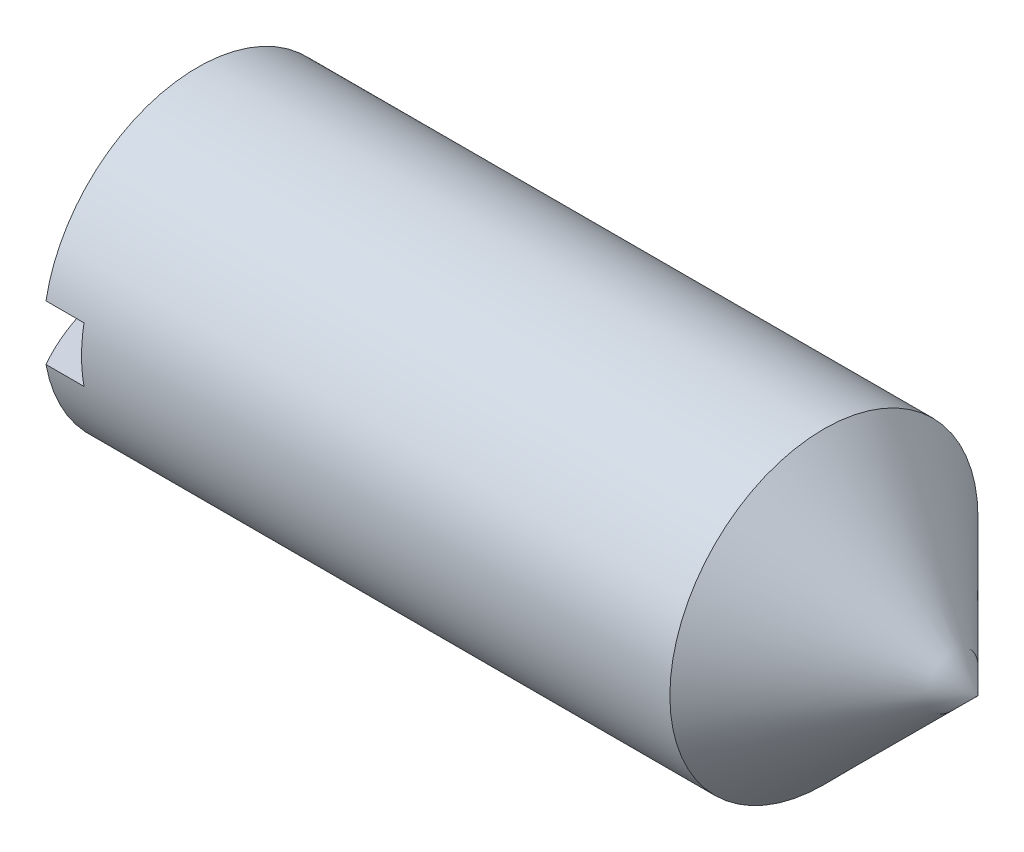
ISO-10303-21;
HEADER;
FILE_DESCRIPTION(('STEP AP214'),'2;1');
FILE_NAME('part.step','',(''),(''),'','','');
FILE_SCHEMA(('AUTOMOTIVE_DESIGN { 1 0 10303 214 1 1 1 1 }'));
ENDSEC;
DATA;
#1=APPLICATION_CONTEXT('core data for automotive mechanical design processes');
#2=APPLICATION_PROTOCOL_DEFINITION('international standard','automotive_design',2000,#1);
#3=PRODUCT_CONTEXT('',#1,'mechanical');
#4=PRODUCT('Part','Part','',(#3));
#5=PRODUCT_RELATED_PRODUCT_CATEGORY('part','',(#4));
#6=PRODUCT_DEFINITION_FORMATION('','',#4);
#7=PRODUCT_DEFINITION_CONTEXT('part definition',#1,'design');
#8=PRODUCT_DEFINITION('design','',#6,#7);
#9=PRODUCT_DEFINITION_SHAPE('','',#8);
#10=(LENGTH_UNIT() NAMED_UNIT(*) SI_UNIT(.MILLI.,.METRE.));
#11=(NAMED_UNIT(*) PLANE_ANGLE_UNIT() SI_UNIT($,.RADIAN.));
#12=(NAMED_UNIT(*) SI_UNIT($,.STERADIAN.) SOLID_ANGLE_UNIT());
#13=UNCERTAINTY_MEASURE_WITH_UNIT(LENGTH_MEASURE(1.E-05),#10,'distance_accuracy_value','');
#14=(GEOMETRIC_REPRESENTATION_CONTEXT(3) GLOBAL_UNCERTAINTY_ASSIGNED_CONTEXT((#13)) GLOBAL_UNIT_ASSIGNED_CONTEXT((#10,
#11,#12)) REPRESENTATION_CONTEXT('',''));
#15=CARTESIAN_POINT('',(0.,0.,0.));
#16=DIRECTION('',(0.,0.,1.));
#17=DIRECTION('',(1.,0.,0.));
#18=AXIS2_PLACEMENT_3D('',#15,#16,#17);
#19=CARTESIAN_POINT('',(19.05,0.,0.));
#20=DIRECTION('',(-1.,0.,0.));
#21=DIRECTION('',(0.,1.,0.));
#22=AXIS2_PLACEMENT_3D('',#19,#20,#21);
#23=SPHERICAL_SURFACE('',#22,19.05);
#24=CARTESIAN_POINT('',(19.05,1.7018,0.));
#25=DIRECTION('',(0.,-1.,0.));
#26=DIRECTION('',(0.,0.,-1.));
#27=AXIS2_PLACEMENT_3D('',#24,#25,#26);
#28=CIRCLE('',#27,18.9738340026469);
#29=CARTESIAN_POINT('',(2.55221605790645,1.7018,9.37173952689681));
#30=VERTEX_POINT('',#29);
#31=CARTESIAN_POINT('',(2.55221605790645,1.7018,-9.37173952689681));
#32=VERTEX_POINT('',#31);
#33=EDGE_CURVE('E97',#30,#32,#28,.T.);
#34=ORIENTED_EDGE('',*,*,#33,.F.);
#35=CARTESIAN_POINT('',(2.55221605790645,0.,0.));
#36=DIRECTION('',(-1.,0.,0.));
#37=DIRECTION('',(0.,0.,1.));
#38=AXIS2_PLACEMENT_3D('',#35,#36,#37);
#39=CIRCLE('',#38,9.525);
#40=EDGE_CURVE('E89',#30,#32,#39,.T.);
#41=ORIENTED_EDGE('',*,*,#40,.T.);
#42=EDGE_LOOP('',(#34,#41));
#43=FACE_BOUND('',#42,.T.);
#44=ADVANCED_FACE('F32',(#43),#23,.T.);
#45=CARTESIAN_POINT('',(19.05,-1.7018,0.));
#46=DIRECTION('',(0.,1.,0.));
#47=DIRECTION('',(0.,0.,1.));
#48=AXIS2_PLACEMENT_3D('',#45,#46,#47);
#49=CIRCLE('',#48,18.9738340026469);
#50=CARTESIAN_POINT('',(2.55221605790645,-1.7018,-9.37173952689681));
#51=VERTEX_POINT('',#50);
#52=CARTESIAN_POINT('',(2.55221605790645,-1.7018,9.37173952689681));
#53=VERTEX_POINT('',#52);
#54=EDGE_CURVE('E109',#51,#53,#49,.T.);
#55=ORIENTED_EDGE('',*,*,#54,.F.);
#56=EDGE_CURVE('E92',#51,#53,#39,.T.);
#57=ORIENTED_EDGE('',*,*,#56,.T.);
#58=EDGE_LOOP('',(#55,#57));
#59=FACE_BOUND('',#58,.T.);
#60=ADVANCED_FACE('F108',(#59),#23,.T.);
#61=CARTESIAN_POINT('',(-12.7,0.,0.));
#62=DIRECTION('',(-1.,0.,0.));
#63=DIRECTION('',(0.,0.,1.));
#64=AXIS2_PLACEMENT_3D('',#61,#62,#63);
#65=CYLINDRICAL_SURFACE('',#64,9.525);
#66=CARTESIAN_POINT('',(41.275,0.,0.));
#67=DIRECTION('',(-1.,0.,0.));
#68=DIRECTION('',(0.,0.,1.));
#69=AXIS2_PLACEMENT_3D('',#66,#67,#68);
#70=CIRCLE('',#69,9.525);
#71=CARTESIAN_POINT('',(41.275,0.,9.525));
#72=VERTEX_POINT('',#71);
#73=EDGE_CURVE('E91',#72,#72,#70,.T.);
#74=ORIENTED_EDGE('',*,*,#73,.T.);
#75=EDGE_LOOP('',(#74));
#76=FACE_BOUND('',#75,.T.);
#77=ORIENTED_EDGE('',*,*,#40,.F.);
#78=DIRECTION('',(-1.,0.,0.));
#79=VECTOR('',#78,1.);
#80=CARTESIAN_POINT('',(-12.7,1.7018,9.37173952689681));
#81=LINE('',#80,#79);
#82=CARTESIAN_POINT('',(4.9022,1.7018,9.37173952689681));
#83=VERTEX_POINT('',#82);
#84=EDGE_CURVE('E11',#30,#83,#81,.F.);
#85=ORIENTED_EDGE('',*,*,#84,.T.);
#86=CARTESIAN_POINT('',(4.9022,0.,0.));
#87=DIRECTION('',(1.,0.,0.));
#88=DIRECTION('',(0.,0.,-1.));
#89=AXIS2_PLACEMENT_3D('',#86,#87,#88);
#90=CIRCLE('',#89,9.525);
#91=CARTESIAN_POINT('',(4.9022,-1.7018,9.37173952689681));
#92=VERTEX_POINT('',#91);
#93=EDGE_CURVE('E70',#92,#83,#90,.F.);
#94=ORIENTED_EDGE('',*,*,#93,.F.);
#95=DIRECTION('',(-1.,0.,0.));
#96=VECTOR('',#95,1.);
#97=CARTESIAN_POINT('',(-12.7,-1.7018,9.37173952689681));
#98=LINE('',#97,#96);
#99=EDGE_CURVE('E39',#92,#53,#98,.T.);
#100=ORIENTED_EDGE('',*,*,#99,.T.);
#101=ORIENTED_EDGE('',*,*,#56,.F.);
#102=DIRECTION('',(-1.,0.,0.));
#103=VECTOR('',#102,1.);
#104=CARTESIAN_POINT('',(-12.7,-1.7018,-9.37173952689681));
#105=LINE('',#104,#103);
#106=CARTESIAN_POINT('',(4.9022,-1.7018,-9.37173952689681));
#107=VERTEX_POINT('',#106);
#108=EDGE_CURVE('E101',#51,#107,#105,.F.);
#109=ORIENTED_EDGE('',*,*,#108,.T.);
#110=CARTESIAN_POINT('',(4.9022,1.7018,-9.37173952689681));
#111=VERTEX_POINT('',#110);
#112=EDGE_CURVE('E79',#111,#107,#90,.F.);
#113=ORIENTED_EDGE('',*,*,#112,.F.);
#114=DIRECTION('',(-1.,0.,0.));
#115=VECTOR('',#114,1.);
#116=CARTESIAN_POINT('',(-12.7,1.7018,-9.37173952689681));
#117=LINE('',#116,#115);
#118=EDGE_CURVE('E77',#111,#32,#117,.T.);
#119=ORIENTED_EDGE('',*,*,#118,.T.);
#120=EDGE_LOOP('',(#77,#85,#94,#100,#101,#109,#113,#119));
#121=FACE_BOUND('',#120,.T.);
#122=ADVANCED_FACE('F87',(#76,#121),#65,.T.);
#123=CARTESIAN_POINT('',(41.275,0.,0.));
#124=DIRECTION('',(-1.,0.,0.));
#125=DIRECTION('',(0.,0.,1.));
#126=AXIS2_PLACEMENT_3D('',#123,#124,#125);
#127=CONICAL_SURFACE('',#126,9.525,0.78539816339745);
#128=CARTESIAN_POINT('',(50.8,0.,0.));
#129=VERTEX_POINT('',#128);
#130=VERTEX_LOOP('',#129);
#131=FACE_BOUND('',#130,.T.);
#132=ORIENTED_EDGE('',*,*,#73,.F.);
#133=EDGE_LOOP('',(#132));
#134=FACE_BOUND('',#133,.T.);
#135=ADVANCED_FACE('F119',(#131,#134),#127,.T.);
#136=CARTESIAN_POINT('',(4.9022,1.7018,-9.525));
#137=DIRECTION('',(0.,-1.,0.));
#138=DIRECTION('',(0.,0.,-1.));
#139=AXIS2_PLACEMENT_3D('',#136,#137,#138);
#140=PLANE('',#139);
#141=ORIENTED_EDGE('',*,*,#33,.T.);
#142=ORIENTED_EDGE('',*,*,#118,.F.);
#143=DIRECTION('',(0.,0.,1.));
#144=VECTOR('',#143,1.);
#145=CARTESIAN_POINT('',(4.9022,1.7018,-9.525));
#146=LINE('',#145,#144);
#147=EDGE_CURVE('E46',#111,#83,#146,.T.);
#148=ORIENTED_EDGE('',*,*,#147,.T.);
#149=ORIENTED_EDGE('',*,*,#84,.F.);
#150=EDGE_LOOP('',(#141,#142,#148,#149));
#151=FACE_BOUND('',#150,.T.);
#152=ADVANCED_FACE('F81',(#151),#140,.T.);
#153=CARTESIAN_POINT('',(4.9022,-1.7018,-9.525));
#154=DIRECTION('',(0.,1.,0.));
#155=DIRECTION('',(0.,0.,1.));
#156=AXIS2_PLACEMENT_3D('',#153,#154,#155);
#157=PLANE('',#156);
#158=ORIENTED_EDGE('',*,*,#54,.T.);
#159=ORIENTED_EDGE('',*,*,#99,.F.);
#160=DIRECTION('',(0.,0.,-1.));
#161=VECTOR('',#160,1.);
#162=CARTESIAN_POINT('',(4.9022,-1.7018,-9.525));
#163=LINE('',#162,#161);
#164=EDGE_CURVE('E73',#92,#107,#163,.T.);
#165=ORIENTED_EDGE('',*,*,#164,.T.);
#166=ORIENTED_EDGE('',*,*,#108,.F.);
#167=EDGE_LOOP('',(#158,#159,#165,#166));
#168=FACE_BOUND('',#167,.T.);
#169=ADVANCED_FACE('F111',(#168),#157,.T.);
#170=CARTESIAN_POINT('',(4.9022,1.7018,-9.525));
#171=DIRECTION('',(1.,0.,0.));
#172=DIRECTION('',(0.,0.,-1.));
#173=AXIS2_PLACEMENT_3D('',#170,#171,#172);
#174=PLANE('',#173);
#175=ORIENTED_EDGE('',*,*,#164,.F.);
#176=ORIENTED_EDGE('',*,*,#93,.T.);
#177=ORIENTED_EDGE('',*,*,#147,.F.);
#178=ORIENTED_EDGE('',*,*,#112,.T.);
#179=EDGE_LOOP('',(#175,#176,#177,#178));
#180=FACE_BOUND('',#179,.T.);
#181=ADVANCED_FACE('F71',(#180),#174,.F.);
#182=CLOSED_SHELL('',(#44,#60,#122,#135,#152,#169,#181));
#183=MANIFOLD_SOLID_BREP('B2',#182);
#184=ADVANCED_BREP_SHAPE_REPRESENTATION('',(#18,#183),#14);
#185=SHAPE_DEFINITION_REPRESENTATION(#9,#184);
ENDSEC;
END-ISO-10303-21;
